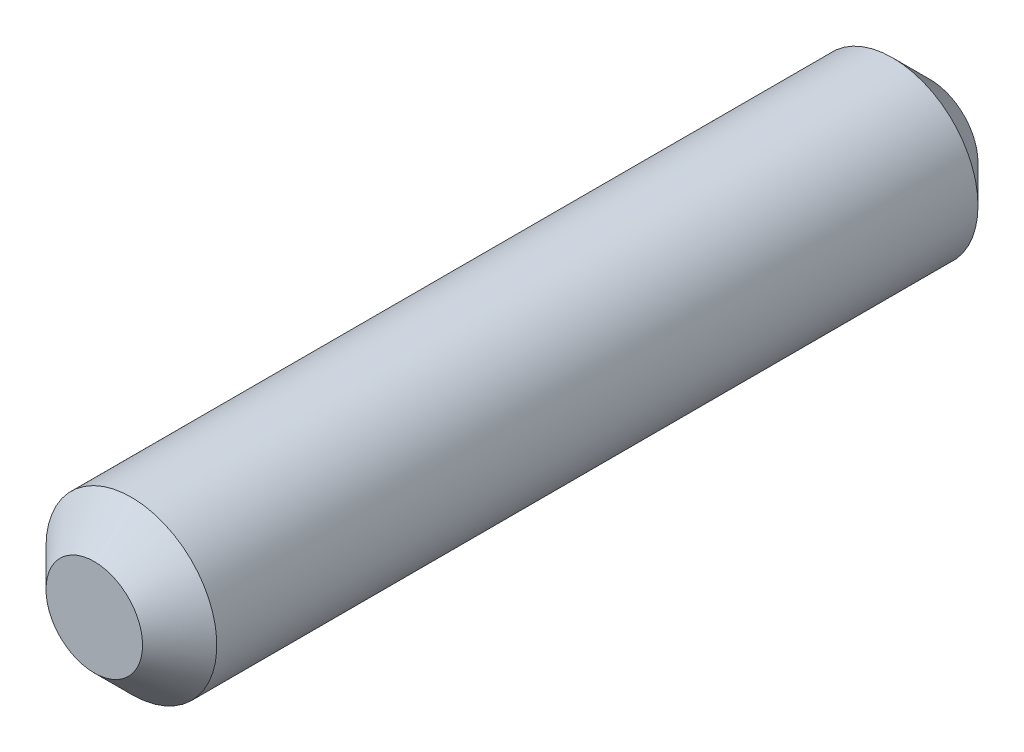
ISO-10303-21;
HEADER;
FILE_DESCRIPTION(('STEP AP214'),'2;1');
FILE_NAME('part.step','',(''),(''),'','','');
FILE_SCHEMA(('AUTOMOTIVE_DESIGN { 1 0 10303 214 1 1 1 1 }'));
ENDSEC;
DATA;
#1=APPLICATION_CONTEXT('core data for automotive mechanical design processes');
#2=APPLICATION_PROTOCOL_DEFINITION('international standard','automotive_design',2000,#1);
#3=PRODUCT_CONTEXT('',#1,'mechanical');
#4=PRODUCT('Part','Part','',(#3));
#5=PRODUCT_RELATED_PRODUCT_CATEGORY('part','',(#4));
#6=PRODUCT_DEFINITION_FORMATION('','',#4);
#7=PRODUCT_DEFINITION_CONTEXT('part definition',#1,'design');
#8=PRODUCT_DEFINITION('design','',#6,#7);
#9=PRODUCT_DEFINITION_SHAPE('','',#8);
#10=(LENGTH_UNIT() NAMED_UNIT(*) SI_UNIT(.MILLI.,.METRE.));
#11=(NAMED_UNIT(*) PLANE_ANGLE_UNIT() SI_UNIT($,.RADIAN.));
#12=(NAMED_UNIT(*) SI_UNIT($,.STERADIAN.) SOLID_ANGLE_UNIT());
#13=UNCERTAINTY_MEASURE_WITH_UNIT(LENGTH_MEASURE(1.E-05),#10,'distance_accuracy_value','');
#14=(GEOMETRIC_REPRESENTATION_CONTEXT(3) GLOBAL_UNCERTAINTY_ASSIGNED_CONTEXT((#13)) GLOBAL_UNIT_ASSIGNED_CONTEXT((#10,
#11,#12)) REPRESENTATION_CONTEXT('',''));
#15=CARTESIAN_POINT('',(0.,0.,0.));
#16=DIRECTION('',(0.,0.,1.));
#17=DIRECTION('',(1.,0.,0.));
#18=AXIS2_PLACEMENT_3D('',#15,#16,#17);
#19=CARTESIAN_POINT('',(0.,0.,11.25));
#20=DIRECTION('',(0.,0.,-1.));
#21=DIRECTION('',(-1.,0.,0.));
#22=AXIS2_PLACEMENT_3D('',#19,#20,#21);
#23=CYLINDRICAL_SURFACE('',#22,2.3);
#24=CARTESIAN_POINT('',(0.,0.,-10.25));
#25=DIRECTION('',(0.,0.,1.));
#26=DIRECTION('',(1.,0.,0.));
#27=AXIS2_PLACEMENT_3D('',#24,#25,#26);
#28=CIRCLE('',#27,2.3);
#29=CARTESIAN_POINT('',(-2.3,0.,-10.25));
#30=VERTEX_POINT('',#29);
#31=EDGE_CURVE('E48',#30,#30,#28,.T.);
#32=CARTESIAN_POINT('',(0.,0.,10.25));
#33=DIRECTION('',(0.,0.,1.));
#34=DIRECTION('',(1.,0.,0.));
#35=AXIS2_PLACEMENT_3D('',#32,#33,#34);
#36=CIRCLE('',#35,2.3);
#37=CARTESIAN_POINT('',(-2.3,0.,10.25));
#38=VERTEX_POINT('',#37);
#39=EDGE_CURVE('E52',#38,#38,#36,.F.);
#40=CARTESIAN_POINT('',(-2.3,0.,-10.25));
#41=CARTESIAN_POINT('',(-2.3,0.,-10.0364583333333));
#42=CARTESIAN_POINT('',(-2.3,0.,-9.82291666666666));
#43=CARTESIAN_POINT('',(-2.3,0.,-9.39583333333332));
#44=CARTESIAN_POINT('',(-2.3,0.,-9.18229166666666));
#45=CARTESIAN_POINT('',(-2.3,0.,-8.75520833333332));
#46=CARTESIAN_POINT('',(-2.3,0.,-8.54166666666665));
#47=CARTESIAN_POINT('',(-2.3,0.,-8.11458333333332));
#48=CARTESIAN_POINT('',(-2.3,0.,-7.90104166666666));
#49=CARTESIAN_POINT('',(-2.3,0.,-7.47395833333332));
#50=CARTESIAN_POINT('',(-2.3,0.,-7.26041666666666));
#51=CARTESIAN_POINT('',(-2.3,0.,-6.83333333333332));
#52=CARTESIAN_POINT('',(-2.3,0.,-6.61979166666666));
#53=CARTESIAN_POINT('',(-2.3,0.,-6.19270833333332));
#54=CARTESIAN_POINT('',(-2.3,0.,-5.97916666666666));
#55=CARTESIAN_POINT('',(-2.3,0.,-5.55208333333332));
#56=CARTESIAN_POINT('',(-2.3,0.,-5.33854166666666));
#57=CARTESIAN_POINT('',(-2.3,0.,-4.91145833333332));
#58=CARTESIAN_POINT('',(-2.3,0.,-4.69791666666666));
#59=CARTESIAN_POINT('',(-2.3,0.,-4.27083333333333));
#60=CARTESIAN_POINT('',(-2.3,0.,-4.05729166666666));
#61=CARTESIAN_POINT('',(-2.3,0.,-3.63020833333333));
#62=CARTESIAN_POINT('',(-2.3,0.,-3.41666666666666));
#63=CARTESIAN_POINT('',(-2.3,0.,-2.98958333333333));
#64=CARTESIAN_POINT('',(-2.3,0.,-2.77604166666666));
#65=CARTESIAN_POINT('',(-2.3,0.,-2.34895833333333));
#66=CARTESIAN_POINT('',(-2.3,0.,-2.13541666666666));
#67=CARTESIAN_POINT('',(-2.3,0.,-1.70833333333333));
#68=CARTESIAN_POINT('',(-2.3,0.,-1.49479166666666));
#69=CARTESIAN_POINT('',(-2.3,0.,-1.06770833333333));
#70=CARTESIAN_POINT('',(-2.3,0.,-0.85416666666666));
#71=CARTESIAN_POINT('',(-2.3,0.,-0.427083333333327));
#72=CARTESIAN_POINT('',(-2.3,0.,-0.21354166666666));
#73=CARTESIAN_POINT('',(-2.3,0.,0.213541666666674));
#74=CARTESIAN_POINT('',(-2.3,0.,0.427083333333341));
#75=CARTESIAN_POINT('',(-2.3,0.,0.854166666666674));
#76=CARTESIAN_POINT('',(-2.3,0.,1.06770833333334));
#77=CARTESIAN_POINT('',(-2.3,0.,1.49479166666667));
#78=CARTESIAN_POINT('',(-2.3,0.,1.70833333333334));
#79=CARTESIAN_POINT('',(-2.3,0.,2.13541666666667));
#80=CARTESIAN_POINT('',(-2.3,0.,2.34895833333334));
#81=CARTESIAN_POINT('',(-2.3,0.,2.77604166666667));
#82=CARTESIAN_POINT('',(-2.3,0.,2.98958333333334));
#83=CARTESIAN_POINT('',(-2.3,0.,3.41666666666667));
#84=CARTESIAN_POINT('',(-2.3,0.,3.63020833333334));
#85=CARTESIAN_POINT('',(-2.3,0.,4.05729166666667));
#86=CARTESIAN_POINT('',(-2.3,0.,4.27083333333334));
#87=CARTESIAN_POINT('',(-2.3,0.,4.69791666666667));
#88=CARTESIAN_POINT('',(-2.3,0.,4.91145833333334));
#89=CARTESIAN_POINT('',(-2.3,0.,5.33854166666667));
#90=CARTESIAN_POINT('',(-2.3,0.,5.55208333333334));
#91=CARTESIAN_POINT('',(-2.3,0.,5.97916666666667));
#92=CARTESIAN_POINT('',(-2.3,0.,6.19270833333334));
#93=CARTESIAN_POINT('',(-2.3,0.,6.61979166666667));
#94=CARTESIAN_POINT('',(-2.3,0.,6.83333333333334));
#95=CARTESIAN_POINT('',(-2.3,0.,7.26041666666667));
#96=CARTESIAN_POINT('',(-2.3,0.,7.47395833333334));
#97=CARTESIAN_POINT('',(-2.3,0.,7.90104166666667));
#98=CARTESIAN_POINT('',(-2.3,0.,8.11458333333334));
#99=CARTESIAN_POINT('',(-2.3,0.,8.54166666666667));
#100=CARTESIAN_POINT('',(-2.3,0.,8.75520833333334));
#101=CARTESIAN_POINT('',(-2.3,0.,9.18229166666667));
#102=CARTESIAN_POINT('',(-2.3,0.,9.39583333333334));
#103=CARTESIAN_POINT('',(-2.3,0.,9.82291666666667));
#104=CARTESIAN_POINT('',(-2.3,0.,10.0364583333333));
#105=CARTESIAN_POINT('',(-2.3,0.,10.25));
#106=B_SPLINE_CURVE_WITH_KNOTS('',3,(#40,#41,#42,#43,#44,#45,#46,#47,#48,#49,#50,#51,#52,#53,
#54,#55,#56,#57,#58,#59,#60,#61,#62,#63,#64,#65,#66,#67,#68,#69,#70,#71,#72,#73,#74,#75,#76,#77,
#78,#79,#80,#81,#82,#83,#84,#85,#86,#87,#88,#89,#90,#91,#92,#93,#94,#95,#96,#97,#98,#99,#100,
#101,#102,#103,#104,#105),.UNSPECIFIED.,.F.,.F.,(4,2,2,2,2,2,2,2,2,2,2,2,2,2,2,2,2,2,2,2,2,2,2,
2,2,2,2,2,2,2,2,2,4),(0.,0.640624999999999,1.28125,1.921875,2.5625,3.203125,3.84375,4.484375,
5.125,5.765625,6.40625,7.046875,7.6875,8.32812499999999,8.96875,9.60937499999999,10.25,
10.890625,11.53125,12.171875,12.8125,13.453125,14.09375,14.734375,15.375,16.015625,16.65625,
17.296875,17.9375,18.578125,19.21875,19.859375,20.5),.UNSPECIFIED.);
#107=EDGE_CURVE('BSEAM36',#30,#38,#106,.T.);
#108=ORIENTED_EDGE('',*,*,#31,.T.);
#109=ORIENTED_EDGE('',*,*,#39,.T.);
#110=ORIENTED_EDGE('',*,*,#107,.T.);
#111=ORIENTED_EDGE('',*,*,#107,.F.);
#112=EDGE_LOOP('',(#108,#110,#109,#111));
#113=FACE_BOUND('',#112,.T.);
#114=ADVANCED_FACE('F36',(#113),#23,.T.);
#115=CARTESIAN_POINT('',(0.,0.,11.25));
#116=DIRECTION('',(0.,0.,1.));
#117=DIRECTION('',(1.,0.,0.));
#118=AXIS2_PLACEMENT_3D('',#115,#116,#117);
#119=PLANE('',#118);
#120=CARTESIAN_POINT('',(0.,0.,11.25));
#121=DIRECTION('',(0.,0.,1.));
#122=DIRECTION('',(1.,0.,0.));
#123=AXIS2_PLACEMENT_3D('',#120,#121,#122);
#124=CIRCLE('',#123,1.30000000000001);
#125=CARTESIAN_POINT('',(1.30000000000001,0.,11.25));
#126=VERTEX_POINT('',#125);
#127=EDGE_CURVE('E10',#126,#126,#124,.T.);
#128=ORIENTED_EDGE('',*,*,#127,.T.);
#129=EDGE_LOOP('',(#128));
#130=FACE_BOUND('',#129,.T.);
#131=ADVANCED_FACE('F68',(#130),#119,.T.);
#132=CARTESIAN_POINT('',(0.,0.,-11.25));
#133=DIRECTION('',(0.,0.,1.));
#134=DIRECTION('',(1.,0.,0.));
#135=AXIS2_PLACEMENT_3D('',#132,#133,#134);
#136=PLANE('',#135);
#137=CARTESIAN_POINT('',(0.,0.,-11.25));
#138=DIRECTION('',(0.,0.,1.));
#139=DIRECTION('',(1.,0.,0.));
#140=AXIS2_PLACEMENT_3D('',#137,#138,#139);
#141=CIRCLE('',#140,1.29999999999998);
#142=CARTESIAN_POINT('',(1.29999999999998,0.,-11.25));
#143=VERTEX_POINT('',#142);
#144=EDGE_CURVE('E44',#143,#143,#141,.F.);
#145=ORIENTED_EDGE('',*,*,#144,.T.);
#146=EDGE_LOOP('',(#145));
#147=FACE_BOUND('',#146,.T.);
#148=ADVANCED_FACE('F65',(#147),#136,.F.);
#149=CARTESIAN_POINT('',(0.,0.,-10.25));
#150=DIRECTION('',(0.,0.,1.));
#151=DIRECTION('',(1.,0.,0.));
#152=AXIS2_PLACEMENT_3D('',#149,#150,#151);
#153=CONICAL_SURFACE('',#152,2.3,0.785398163397452);
#154=ORIENTED_EDGE('',*,*,#144,.F.);
#155=EDGE_LOOP('',(#154));
#156=FACE_BOUND('',#155,.T.);
#157=ORIENTED_EDGE('',*,*,#31,.F.);
#158=EDGE_LOOP('',(#157));
#159=FACE_BOUND('',#158,.T.);
#160=ADVANCED_FACE('F61',(#156,#159),#153,.T.);
#161=CARTESIAN_POINT('',(0.,0.,11.25));
#162=DIRECTION('',(0.,0.,-1.));
#163=DIRECTION('',(-1.,0.,0.));
#164=AXIS2_PLACEMENT_3D('',#161,#162,#163);
#165=CONICAL_SURFACE('',#164,1.30000000000001,0.785398163397446);
#166=ORIENTED_EDGE('',*,*,#39,.F.);
#167=EDGE_LOOP('',(#166));
#168=FACE_BOUND('',#167,.T.);
#169=ORIENTED_EDGE('',*,*,#127,.F.);
#170=EDGE_LOOP('',(#169));
#171=FACE_BOUND('',#170,.T.);
#172=ADVANCED_FACE('F39',(#168,#171),#165,.T.);
#173=CLOSED_SHELL('',(#114,#131,#148,#160,#172));
#174=MANIFOLD_SOLID_BREP('B2',#173);
#175=ADVANCED_BREP_SHAPE_REPRESENTATION('',(#18,#174),#14);
#176=SHAPE_DEFINITION_REPRESENTATION(#9,#175);
ENDSEC;
END-ISO-10303-21;
